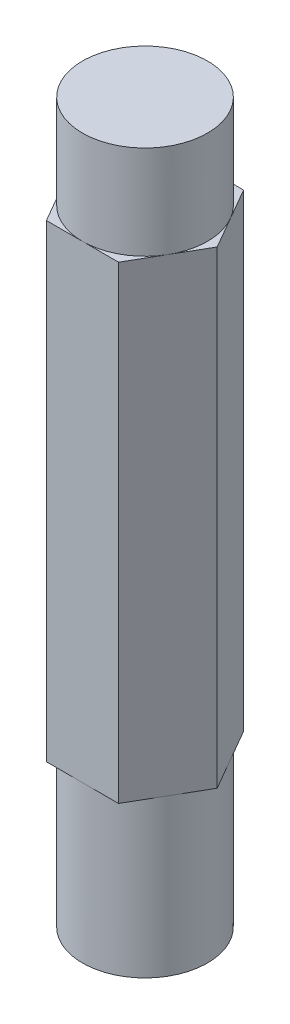
ISO-10303-21;
HEADER;
FILE_DESCRIPTION(('STEP AP214'),'2;1');
FILE_NAME('part.step','',(''),(''),'','','');
FILE_SCHEMA(('AUTOMOTIVE_DESIGN { 1 0 10303 214 1 1 1 1 }'));
ENDSEC;
DATA;
#1=APPLICATION_CONTEXT('core data for automotive mechanical design processes');
#2=APPLICATION_PROTOCOL_DEFINITION('international standard','automotive_design',2000,#1);
#3=PRODUCT_CONTEXT('',#1,'mechanical');
#4=PRODUCT('Part','Part','',(#3));
#5=PRODUCT_RELATED_PRODUCT_CATEGORY('part','',(#4));
#6=PRODUCT_DEFINITION_FORMATION('','',#4);
#7=PRODUCT_DEFINITION_CONTEXT('part definition',#1,'design');
#8=PRODUCT_DEFINITION('design','',#6,#7);
#9=PRODUCT_DEFINITION_SHAPE('','',#8);
#10=(LENGTH_UNIT() NAMED_UNIT(*) SI_UNIT(.MILLI.,.METRE.));
#11=(NAMED_UNIT(*) PLANE_ANGLE_UNIT() SI_UNIT($,.RADIAN.));
#12=(NAMED_UNIT(*) SI_UNIT($,.STERADIAN.) SOLID_ANGLE_UNIT());
#13=UNCERTAINTY_MEASURE_WITH_UNIT(LENGTH_MEASURE(1.E-05),#10,'distance_accuracy_value','');
#14=(GEOMETRIC_REPRESENTATION_CONTEXT(3) GLOBAL_UNCERTAINTY_ASSIGNED_CONTEXT((#13)) GLOBAL_UNIT_ASSIGNED_CONTEXT((#10,
#11,#12)) REPRESENTATION_CONTEXT('',''));
#15=CARTESIAN_POINT('',(0.,0.,0.));
#16=DIRECTION('',(0.,0.,1.));
#17=DIRECTION('',(1.,0.,0.));
#18=AXIS2_PLACEMENT_3D('',#15,#16,#17);
#19=CARTESIAN_POINT('',(0.,-7.5,0.));
#20=DIRECTION('',(0.,1.,0.));
#21=DIRECTION('',(0.,0.,1.));
#22=AXIS2_PLACEMENT_3D('',#19,#20,#21);
#23=PLANE('',#22);
#24=CARTESIAN_POINT('',(0.,-7.5,0.));
#25=DIRECTION('',(0.,-1.,0.));
#26=DIRECTION('',(0.,0.,-1.));
#27=AXIS2_PLACEMENT_3D('',#24,#25,#26);
#28=CIRCLE('',#27,2.);
#29=CARTESIAN_POINT('',(0.,-7.5,-2.));
#30=VERTEX_POINT('',#29);
#31=CARTESIAN_POINT('',(1.73205080756888,-7.5,-1.));
#32=VERTEX_POINT('',#31);
#33=EDGE_CURVE('E54',#30,#32,#28,.T.);
#34=ORIENTED_EDGE('',*,*,#33,.F.);
#35=DIRECTION('',(-1.,0.,0.));
#36=VECTOR('',#35,1.);
#37=CARTESIAN_POINT('',(1.15470053837925,-7.5,-2.));
#38=LINE('',#37,#36);
#39=CARTESIAN_POINT('',(1.15470053837925,-7.5,-2.));
#40=VERTEX_POINT('',#39);
#41=EDGE_CURVE('E138',#40,#30,#38,.T.);
#42=ORIENTED_EDGE('',*,*,#41,.F.);
#43=DIRECTION('',(-0.5,0.,-0.866025403784439));
#44=VECTOR('',#43,1.);
#45=CARTESIAN_POINT('',(2.3094010767585,-7.5,0.));
#46=LINE('',#45,#44);
#47=EDGE_CURVE('E161',#32,#40,#46,.T.);
#48=ORIENTED_EDGE('',*,*,#47,.F.);
#49=EDGE_LOOP('',(#34,#42,#48));
#50=FACE_BOUND('',#49,.T.);
#51=ADVANCED_FACE('F43',(#50),#23,.F.);
#52=CARTESIAN_POINT('',(1.73205080756888,-7.5,1.));
#53=VERTEX_POINT('',#52);
#54=EDGE_CURVE('E11',#32,#53,#28,.T.);
#55=ORIENTED_EDGE('',*,*,#54,.F.);
#56=CARTESIAN_POINT('',(2.3094010767585,-7.5,0.));
#57=VERTEX_POINT('',#56);
#58=EDGE_CURVE('E159',#57,#32,#46,.T.);
#59=ORIENTED_EDGE('',*,*,#58,.F.);
#60=DIRECTION('',(0.5,0.,-0.866025403784438));
#61=VECTOR('',#60,1.);
#62=CARTESIAN_POINT('',(1.15470053837925,-7.5,2.));
#63=LINE('',#62,#61);
#64=EDGE_CURVE('E211',#53,#57,#63,.T.);
#65=ORIENTED_EDGE('',*,*,#64,.F.);
#66=EDGE_LOOP('',(#55,#59,#65));
#67=FACE_BOUND('',#66,.T.);
#68=ADVANCED_FACE('F256',(#67),#23,.F.);
#69=CARTESIAN_POINT('',(0.,-7.5,2.));
#70=VERTEX_POINT('',#69);
#71=EDGE_CURVE('E52',#53,#70,#28,.T.);
#72=ORIENTED_EDGE('',*,*,#71,.F.);
#73=CARTESIAN_POINT('',(1.15470053837925,-7.5,2.));
#74=VERTEX_POINT('',#73);
#75=EDGE_CURVE('E212',#74,#53,#63,.T.);
#76=ORIENTED_EDGE('',*,*,#75,.F.);
#77=DIRECTION('',(1.,0.,0.));
#78=VECTOR('',#77,1.);
#79=CARTESIAN_POINT('',(-1.15470053837925,-7.5,2.));
#80=LINE('',#79,#78);
#81=EDGE_CURVE('E207',#70,#74,#80,.T.);
#82=ORIENTED_EDGE('',*,*,#81,.F.);
#83=EDGE_LOOP('',(#72,#76,#82));
#84=FACE_BOUND('',#83,.T.);
#85=ADVANCED_FACE('F260',(#84),#23,.F.);
#86=CARTESIAN_POINT('',(-1.73205080756888,-7.5,1.));
#87=VERTEX_POINT('',#86);
#88=EDGE_CURVE('E68',#70,#87,#28,.T.);
#89=ORIENTED_EDGE('',*,*,#88,.F.);
#90=CARTESIAN_POINT('',(-1.15470053837925,-7.5,2.));
#91=VERTEX_POINT('',#90);
#92=EDGE_CURVE('E208',#91,#70,#80,.T.);
#93=ORIENTED_EDGE('',*,*,#92,.F.);
#94=DIRECTION('',(0.5,0.,0.866025403784439));
#95=VECTOR('',#94,1.);
#96=CARTESIAN_POINT('',(-2.3094010767585,-7.5,0.));
#97=LINE('',#96,#95);
#98=EDGE_CURVE('E203',#87,#91,#97,.T.);
#99=ORIENTED_EDGE('',*,*,#98,.F.);
#100=EDGE_LOOP('',(#89,#93,#99));
#101=FACE_BOUND('',#100,.T.);
#102=ADVANCED_FACE('F263',(#101),#23,.F.);
#103=CARTESIAN_POINT('',(-1.73205080756888,-7.5,-1.));
#104=VERTEX_POINT('',#103);
#105=EDGE_CURVE('E61',#87,#104,#28,.T.);
#106=ORIENTED_EDGE('',*,*,#105,.F.);
#107=CARTESIAN_POINT('',(-2.3094010767585,-7.5,0.));
#108=VERTEX_POINT('',#107);
#109=EDGE_CURVE('E204',#108,#87,#97,.T.);
#110=ORIENTED_EDGE('',*,*,#109,.F.);
#111=DIRECTION('',(-0.5,0.,0.866025403784439));
#112=VECTOR('',#111,1.);
#113=CARTESIAN_POINT('',(-1.15470053837925,-7.5,-2.));
#114=LINE('',#113,#112);
#115=EDGE_CURVE('E175',#104,#108,#114,.T.);
#116=ORIENTED_EDGE('',*,*,#115,.F.);
#117=EDGE_LOOP('',(#106,#110,#116));
#118=FACE_BOUND('',#117,.T.);
#119=ADVANCED_FACE('F265',(#118),#23,.F.);
#120=CARTESIAN_POINT('',(0.,7.5,0.));
#121=DIRECTION('',(0.,1.,0.));
#122=DIRECTION('',(0.,0.,1.));
#123=AXIS2_PLACEMENT_3D('',#120,#121,#122);
#124=PLANE('',#123);
#125=CARTESIAN_POINT('',(0.,7.5,0.));
#126=DIRECTION('',(0.,1.,0.));
#127=DIRECTION('',(0.,0.,1.));
#128=AXIS2_PLACEMENT_3D('',#125,#126,#127);
#129=CIRCLE('',#128,2.);
#130=CARTESIAN_POINT('',(0.,7.5,2.));
#131=VERTEX_POINT('',#130);
#132=CARTESIAN_POINT('',(1.73205080756888,7.5,1.));
#133=VERTEX_POINT('',#132);
#134=EDGE_CURVE('E170',#131,#133,#129,.T.);
#135=ORIENTED_EDGE('',*,*,#134,.F.);
#136=DIRECTION('',(1.,0.,0.));
#137=VECTOR('',#136,1.);
#138=CARTESIAN_POINT('',(-1.15470053837925,7.5,2.));
#139=LINE('',#138,#137);
#140=CARTESIAN_POINT('',(1.15470053837925,7.5,2.));
#141=VERTEX_POINT('',#140);
#142=EDGE_CURVE('E186',#131,#141,#139,.T.);
#143=ORIENTED_EDGE('',*,*,#142,.T.);
#144=DIRECTION('',(0.5,0.,-0.866025403784438));
#145=VECTOR('',#144,1.);
#146=CARTESIAN_POINT('',(1.15470053837925,7.5,2.));
#147=LINE('',#146,#145);
#148=EDGE_CURVE('E190',#141,#133,#147,.T.);
#149=ORIENTED_EDGE('',*,*,#148,.T.);
#150=EDGE_LOOP('',(#135,#143,#149));
#151=FACE_BOUND('',#150,.T.);
#152=ADVANCED_FACE('F296',(#151),#124,.T.);
#153=CARTESIAN_POINT('',(1.73205080756888,7.5,-1.));
#154=VERTEX_POINT('',#153);
#155=EDGE_CURVE('E166',#133,#154,#129,.T.);
#156=ORIENTED_EDGE('',*,*,#155,.F.);
#157=CARTESIAN_POINT('',(2.3094010767585,7.5,0.));
#158=VERTEX_POINT('',#157);
#159=EDGE_CURVE('E189',#133,#158,#147,.T.);
#160=ORIENTED_EDGE('',*,*,#159,.T.);
#161=DIRECTION('',(-0.5,0.,-0.866025403784439));
#162=VECTOR('',#161,1.);
#163=CARTESIAN_POINT('',(2.3094010767585,7.5,0.));
#164=LINE('',#163,#162);
#165=EDGE_CURVE('E194',#158,#154,#164,.T.);
#166=ORIENTED_EDGE('',*,*,#165,.T.);
#167=EDGE_LOOP('',(#156,#160,#166));
#168=FACE_BOUND('',#167,.T.);
#169=ADVANCED_FACE('F247',(#168),#124,.T.);
#170=CARTESIAN_POINT('',(0.,7.5,-2.));
#171=VERTEX_POINT('',#170);
#172=EDGE_CURVE('E168',#154,#171,#129,.T.);
#173=ORIENTED_EDGE('',*,*,#172,.F.);
#174=CARTESIAN_POINT('',(1.15470053837925,7.5,-2.));
#175=VERTEX_POINT('',#174);
#176=EDGE_CURVE('E193',#154,#175,#164,.T.);
#177=ORIENTED_EDGE('',*,*,#176,.T.);
#178=DIRECTION('',(-1.,0.,0.));
#179=VECTOR('',#178,1.);
#180=CARTESIAN_POINT('',(1.15470053837925,7.5,-2.));
#181=LINE('',#180,#179);
#182=EDGE_CURVE('E198',#175,#171,#181,.T.);
#183=ORIENTED_EDGE('',*,*,#182,.T.);
#184=EDGE_LOOP('',(#173,#177,#183));
#185=FACE_BOUND('',#184,.T.);
#186=ADVANCED_FACE('F242',(#185),#124,.T.);
#187=CARTESIAN_POINT('',(-1.73205080756888,7.5,-1.));
#188=VERTEX_POINT('',#187);
#189=EDGE_CURVE('E236',#171,#188,#129,.T.);
#190=ORIENTED_EDGE('',*,*,#189,.F.);
#191=CARTESIAN_POINT('',(-1.15470053837925,7.5,-2.));
#192=VERTEX_POINT('',#191);
#193=EDGE_CURVE('E197',#171,#192,#181,.T.);
#194=ORIENTED_EDGE('',*,*,#193,.T.);
#195=DIRECTION('',(-0.5,0.,0.866025403784439));
#196=VECTOR('',#195,1.);
#197=CARTESIAN_POINT('',(-1.15470053837925,7.5,-2.));
#198=LINE('',#197,#196);
#199=EDGE_CURVE('E179',#192,#188,#198,.T.);
#200=ORIENTED_EDGE('',*,*,#199,.T.);
#201=EDGE_LOOP('',(#190,#194,#200));
#202=FACE_BOUND('',#201,.T.);
#203=ADVANCED_FACE('F271',(#202),#124,.T.);
#204=CARTESIAN_POINT('',(-1.73205080756888,7.5,1.));
#205=VERTEX_POINT('',#204);
#206=EDGE_CURVE('E233',#188,#205,#129,.T.);
#207=ORIENTED_EDGE('',*,*,#206,.F.);
#208=CARTESIAN_POINT('',(-2.3094010767585,7.5,0.));
#209=VERTEX_POINT('',#208);
#210=EDGE_CURVE('E150',#188,#209,#198,.T.);
#211=ORIENTED_EDGE('',*,*,#210,.T.);
#212=DIRECTION('',(0.5,0.,0.866025403784439));
#213=VECTOR('',#212,1.);
#214=CARTESIAN_POINT('',(-2.3094010767585,7.5,0.));
#215=LINE('',#214,#213);
#216=EDGE_CURVE('E183',#209,#205,#215,.T.);
#217=ORIENTED_EDGE('',*,*,#216,.T.);
#218=EDGE_LOOP('',(#207,#211,#217));
#219=FACE_BOUND('',#218,.T.);
#220=ADVANCED_FACE('F273',(#219),#124,.T.);
#221=CARTESIAN_POINT('',(-1.15470053837925,7.5,-2.));
#222=DIRECTION('',(0.866025403784438,0.,0.5));
#223=DIRECTION('',(0.5,0.,-0.866025403784439));
#224=AXIS2_PLACEMENT_3D('',#221,#222,#223);
#225=PLANE('',#224);
#226=CARTESIAN_POINT('',(-1.15470053837925,-7.5,-2.));
#227=VERTEX_POINT('',#226);
#228=EDGE_CURVE('E158',#227,#104,#114,.T.);
#229=ORIENTED_EDGE('',*,*,#228,.T.);
#230=ORIENTED_EDGE('',*,*,#115,.T.);
#231=DIRECTION('',(0.,-1.,0.));
#232=VECTOR('',#231,1.);
#233=CARTESIAN_POINT('',(-2.3094010767585,7.5,0.));
#234=LINE('',#233,#232);
#235=EDGE_CURVE('E47',#209,#108,#234,.T.);
#236=ORIENTED_EDGE('',*,*,#235,.F.);
#237=ORIENTED_EDGE('',*,*,#210,.F.);
#238=ORIENTED_EDGE('',*,*,#199,.F.);
#239=DIRECTION('',(0.,-1.,0.));
#240=VECTOR('',#239,1.);
#241=CARTESIAN_POINT('',(-1.15470053837925,7.5,-2.));
#242=LINE('',#241,#240);
#243=EDGE_CURVE('E201',#192,#227,#242,.T.);
#244=ORIENTED_EDGE('',*,*,#243,.T.);
#245=EDGE_LOOP('',(#229,#230,#236,#237,#238,#244));
#246=FACE_BOUND('',#245,.T.);
#247=ADVANCED_FACE('F45',(#246),#225,.F.);
#248=CARTESIAN_POINT('',(-2.3094010767585,7.5,0.));
#249=DIRECTION('',(0.866025403784439,0.,-0.5));
#250=DIRECTION('',(-0.5,0.,-0.866025403784439));
#251=AXIS2_PLACEMENT_3D('',#248,#249,#250);
#252=PLANE('',#251);
#253=ORIENTED_EDGE('',*,*,#109,.T.);
#254=ORIENTED_EDGE('',*,*,#98,.T.);
#255=DIRECTION('',(0.,-1.,0.));
#256=VECTOR('',#255,1.);
#257=CARTESIAN_POINT('',(-1.15470053837925,7.5,2.));
#258=LINE('',#257,#256);
#259=CARTESIAN_POINT('',(-1.15470053837925,7.5,2.));
#260=VERTEX_POINT('',#259);
#261=EDGE_CURVE('E223',#260,#91,#258,.T.);
#262=ORIENTED_EDGE('',*,*,#261,.F.);
#263=EDGE_CURVE('E182',#205,#260,#215,.T.);
#264=ORIENTED_EDGE('',*,*,#263,.F.);
#265=ORIENTED_EDGE('',*,*,#216,.F.);
#266=ORIENTED_EDGE('',*,*,#235,.T.);
#267=EDGE_LOOP('',(#253,#254,#262,#264,#265,#266));
#268=FACE_BOUND('',#267,.T.);
#269=ADVANCED_FACE('F264',(#268),#252,.F.);
#270=CARTESIAN_POINT('',(-1.15470053837925,7.5,2.));
#271=DIRECTION('',(0.,0.,-1.));
#272=DIRECTION('',(-1.,0.,0.));
#273=AXIS2_PLACEMENT_3D('',#270,#271,#272);
#274=PLANE('',#273);
#275=ORIENTED_EDGE('',*,*,#92,.T.);
#276=ORIENTED_EDGE('',*,*,#81,.T.);
#277=DIRECTION('',(0.,-1.,0.));
#278=VECTOR('',#277,1.);
#279=CARTESIAN_POINT('',(1.15470053837925,7.5,2.));
#280=LINE('',#279,#278);
#281=EDGE_CURVE('E221',#141,#74,#280,.T.);
#282=ORIENTED_EDGE('',*,*,#281,.F.);
#283=ORIENTED_EDGE('',*,*,#142,.F.);
#284=EDGE_CURVE('E187',#260,#131,#139,.T.);
#285=ORIENTED_EDGE('',*,*,#284,.F.);
#286=ORIENTED_EDGE('',*,*,#261,.T.);
#287=EDGE_LOOP('',(#275,#276,#282,#283,#285,#286));
#288=FACE_BOUND('',#287,.T.);
#289=ADVANCED_FACE('F262',(#288),#274,.F.);
#290=CARTESIAN_POINT('',(1.15470053837925,7.5,2.));
#291=DIRECTION('',(-0.866025403784438,0.,-0.5));
#292=DIRECTION('',(-0.5,0.,0.866025403784439));
#293=AXIS2_PLACEMENT_3D('',#290,#291,#292);
#294=PLANE('',#293);
#295=ORIENTED_EDGE('',*,*,#75,.T.);
#296=ORIENTED_EDGE('',*,*,#64,.T.);
#297=DIRECTION('',(0.,-1.,0.));
#298=VECTOR('',#297,1.);
#299=CARTESIAN_POINT('',(2.3094010767585,7.5,0.));
#300=LINE('',#299,#298);
#301=EDGE_CURVE('E218',#158,#57,#300,.T.);
#302=ORIENTED_EDGE('',*,*,#301,.F.);
#303=ORIENTED_EDGE('',*,*,#159,.F.);
#304=ORIENTED_EDGE('',*,*,#148,.F.);
#305=ORIENTED_EDGE('',*,*,#281,.T.);
#306=EDGE_LOOP('',(#295,#296,#302,#303,#304,#305));
#307=FACE_BOUND('',#306,.T.);
#308=ADVANCED_FACE('F252',(#307),#294,.F.);
#309=CARTESIAN_POINT('',(2.3094010767585,7.5,0.));
#310=DIRECTION('',(-0.866025403784439,0.,0.5));
#311=DIRECTION('',(0.5,0.,0.866025403784439));
#312=AXIS2_PLACEMENT_3D('',#309,#310,#311);
#313=PLANE('',#312);
#314=ORIENTED_EDGE('',*,*,#58,.T.);
#315=ORIENTED_EDGE('',*,*,#47,.T.);
#316=DIRECTION('',(0.,-1.,0.));
#317=VECTOR('',#316,1.);
#318=CARTESIAN_POINT('',(1.15470053837925,7.5,-2.));
#319=LINE('',#318,#317);
#320=EDGE_CURVE('E146',#175,#40,#319,.T.);
#321=ORIENTED_EDGE('',*,*,#320,.F.);
#322=ORIENTED_EDGE('',*,*,#176,.F.);
#323=ORIENTED_EDGE('',*,*,#165,.F.);
#324=ORIENTED_EDGE('',*,*,#301,.T.);
#325=EDGE_LOOP('',(#314,#315,#321,#322,#323,#324));
#326=FACE_BOUND('',#325,.T.);
#327=ADVANCED_FACE('F245',(#326),#313,.F.);
#328=CARTESIAN_POINT('',(1.15470053837925,7.5,-2.));
#329=DIRECTION('',(0.,0.,1.));
#330=DIRECTION('',(1.,0.,0.));
#331=AXIS2_PLACEMENT_3D('',#328,#329,#330);
#332=PLANE('',#331);
#333=ORIENTED_EDGE('',*,*,#41,.T.);
#334=EDGE_CURVE('E142',#30,#227,#38,.T.);
#335=ORIENTED_EDGE('',*,*,#334,.T.);
#336=ORIENTED_EDGE('',*,*,#243,.F.);
#337=ORIENTED_EDGE('',*,*,#193,.F.);
#338=ORIENTED_EDGE('',*,*,#182,.F.);
#339=ORIENTED_EDGE('',*,*,#320,.T.);
#340=EDGE_LOOP('',(#333,#335,#336,#337,#338,#339));
#341=FACE_BOUND('',#340,.T.);
#342=ADVANCED_FACE('F140',(#341),#332,.F.);
#343=EDGE_CURVE('E178',#205,#131,#129,.T.);
#344=ORIENTED_EDGE('',*,*,#343,.F.);
#345=ORIENTED_EDGE('',*,*,#263,.T.);
#346=ORIENTED_EDGE('',*,*,#284,.T.);
#347=EDGE_LOOP('',(#344,#345,#346));
#348=FACE_BOUND('',#347,.T.);
#349=ADVANCED_FACE('F280',(#348),#124,.T.);
#350=EDGE_CURVE('E156',#104,#30,#28,.T.);
#351=ORIENTED_EDGE('',*,*,#350,.F.);
#352=ORIENTED_EDGE('',*,*,#228,.F.);
#353=ORIENTED_EDGE('',*,*,#334,.F.);
#354=EDGE_LOOP('',(#351,#352,#353));
#355=FACE_BOUND('',#354,.T.);
#356=ADVANCED_FACE('F154',(#355),#23,.F.);
#357=CARTESIAN_POINT('',(0.,10.5,0.));
#358=DIRECTION('',(0.,-1.,0.));
#359=DIRECTION('',(0.,0.,-1.));
#360=AXIS2_PLACEMENT_3D('',#357,#358,#359);
#361=CYLINDRICAL_SURFACE('',#360,2.);
#362=CARTESIAN_POINT('',(0.,10.5,0.));
#363=DIRECTION('',(0.,1.,0.));
#364=DIRECTION('',(0.,0.,1.));
#365=AXIS2_PLACEMENT_3D('',#362,#363,#364);
#366=CIRCLE('',#365,2.);
#367=CARTESIAN_POINT('',(0.,10.5,2.));
#368=VERTEX_POINT('',#367);
#369=EDGE_CURVE('E173',#368,#368,#366,.T.);
#370=ORIENTED_EDGE('',*,*,#369,.F.);
#371=EDGE_LOOP('',(#370));
#372=FACE_BOUND('',#371,.T.);
#373=ORIENTED_EDGE('',*,*,#134,.T.);
#374=ORIENTED_EDGE('',*,*,#155,.T.);
#375=ORIENTED_EDGE('',*,*,#172,.T.);
#376=ORIENTED_EDGE('',*,*,#189,.T.);
#377=ORIENTED_EDGE('',*,*,#206,.T.);
#378=ORIENTED_EDGE('',*,*,#343,.T.);
#379=EDGE_LOOP('',(#373,#374,#375,#376,#377,#378));
#380=FACE_BOUND('',#379,.T.);
#381=ADVANCED_FACE('F239',(#372,#380),#361,.T.);
#382=CARTESIAN_POINT('',(0.,10.5,0.));
#383=DIRECTION('',(0.,1.,0.));
#384=DIRECTION('',(0.,0.,1.));
#385=AXIS2_PLACEMENT_3D('',#382,#383,#384);
#386=PLANE('',#385);
#387=ORIENTED_EDGE('',*,*,#369,.T.);
#388=EDGE_LOOP('',(#387));
#389=FACE_BOUND('',#388,.T.);
#390=ADVANCED_FACE('F293',(#389),#386,.T.);
#391=CARTESIAN_POINT('',(0.,-12.5,0.));
#392=DIRECTION('',(0.,1.,0.));
#393=DIRECTION('',(0.,0.,1.));
#394=AXIS2_PLACEMENT_3D('',#391,#392,#393);
#395=CYLINDRICAL_SURFACE('',#394,2.);
#396=CARTESIAN_POINT('',(0.,-12.5,0.));
#397=DIRECTION('',(0.,-1.,0.));
#398=DIRECTION('',(0.,0.,-1.));
#399=AXIS2_PLACEMENT_3D('',#396,#397,#398);
#400=CIRCLE('',#399,2.);
#401=CARTESIAN_POINT('',(0.,-12.5,-2.));
#402=VERTEX_POINT('',#401);
#403=EDGE_CURVE('E164',#402,#402,#400,.T.);
#404=ORIENTED_EDGE('',*,*,#403,.F.);
#405=EDGE_LOOP('',(#404));
#406=FACE_BOUND('',#405,.T.);
#407=ORIENTED_EDGE('',*,*,#33,.T.);
#408=ORIENTED_EDGE('',*,*,#54,.T.);
#409=ORIENTED_EDGE('',*,*,#71,.T.);
#410=ORIENTED_EDGE('',*,*,#88,.T.);
#411=ORIENTED_EDGE('',*,*,#105,.T.);
#412=ORIENTED_EDGE('',*,*,#350,.T.);
#413=EDGE_LOOP('',(#407,#408,#409,#410,#411,#412));
#414=FACE_BOUND('',#413,.T.);
#415=ADVANCED_FACE('F165',(#406,#414),#395,.T.);
#416=CARTESIAN_POINT('',(0.,-12.5,0.));
#417=DIRECTION('',(0.,-1.,0.));
#418=DIRECTION('',(0.,0.,-1.));
#419=AXIS2_PLACEMENT_3D('',#416,#417,#418);
#420=PLANE('',#419);
#421=ORIENTED_EDGE('',*,*,#403,.T.);
#422=EDGE_LOOP('',(#421));
#423=FACE_BOUND('',#422,.T.);
#424=ADVANCED_FACE('F418',(#423),#420,.T.);
#425=CLOSED_SHELL('',(#51,#68,#85,#102,#119,#152,#169,#186,#203,#220,#247,#269,#289,#308,#327,
#342,#349,#356,#381,#390,#415,#424));
#426=MANIFOLD_SOLID_BREP('B2',#425);
#427=ADVANCED_BREP_SHAPE_REPRESENTATION('',(#18,#426),#14);
#428=SHAPE_DEFINITION_REPRESENTATION(#9,#427);
ENDSEC;
END-ISO-10303-21;
